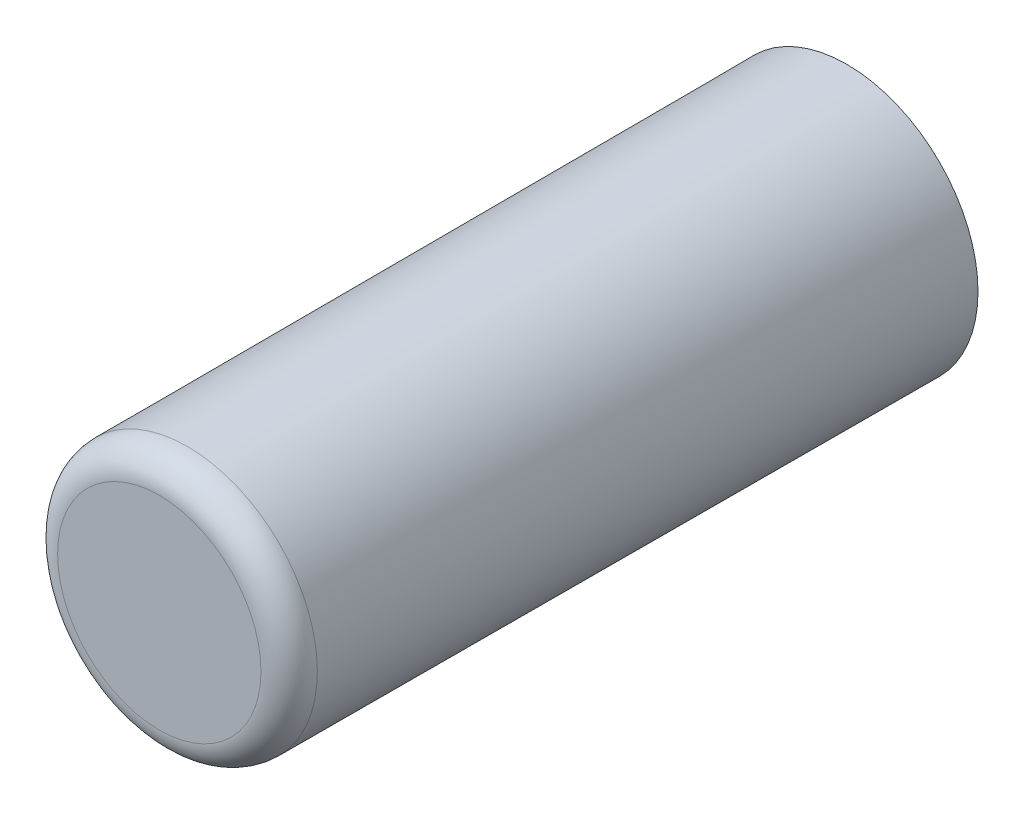
ISO-10303-21;
HEADER;
FILE_DESCRIPTION(('STEP AP214'),'2;1');
FILE_NAME('part.step','',(''),(''),'','','');
FILE_SCHEMA(('AUTOMOTIVE_DESIGN { 1 0 10303 214 1 1 1 1 }'));
ENDSEC;
DATA;
#1=APPLICATION_CONTEXT('core data for automotive mechanical design processes');
#2=APPLICATION_PROTOCOL_DEFINITION('international standard','automotive_design',2000,#1);
#3=PRODUCT_CONTEXT('',#1,'mechanical');
#4=PRODUCT('Part','Part','',(#3));
#5=PRODUCT_RELATED_PRODUCT_CATEGORY('part','',(#4));
#6=PRODUCT_DEFINITION_FORMATION('','',#4);
#7=PRODUCT_DEFINITION_CONTEXT('part definition',#1,'design');
#8=PRODUCT_DEFINITION('design','',#6,#7);
#9=PRODUCT_DEFINITION_SHAPE('','',#8);
#10=(LENGTH_UNIT() NAMED_UNIT(*) SI_UNIT(.MILLI.,.METRE.));
#11=(NAMED_UNIT(*) PLANE_ANGLE_UNIT() SI_UNIT($,.RADIAN.));
#12=(NAMED_UNIT(*) SI_UNIT($,.STERADIAN.) SOLID_ANGLE_UNIT());
#13=UNCERTAINTY_MEASURE_WITH_UNIT(LENGTH_MEASURE(1.E-05),#10,'distance_accuracy_value','');
#14=(GEOMETRIC_REPRESENTATION_CONTEXT(3) GLOBAL_UNCERTAINTY_ASSIGNED_CONTEXT((#13)) GLOBAL_UNIT_ASSIGNED_CONTEXT((#10,
#11,#12)) REPRESENTATION_CONTEXT('',''));
#15=CARTESIAN_POINT('',(0.,0.,0.));
#16=DIRECTION('',(0.,0.,1.));
#17=DIRECTION('',(1.,0.,0.));
#18=AXIS2_PLACEMENT_3D('',#15,#16,#17);
#19=CARTESIAN_POINT('',(0.,0.,0.380999999999993));
#20=DIRECTION('',(0.,0.,-1.));
#21=DIRECTION('',(-1.,0.,0.));
#22=AXIS2_PLACEMENT_3D('',#19,#20,#21);
#23=TOROIDAL_SURFACE('',#22,7.493,0.889);
#24=CARTESIAN_POINT('',(-8.382,0.,0.380999999999993));
#25=VERTEX_POINT('',#24);
#26=VERTEX_LOOP('',#25);
#27=FACE_BOUND('',#26,.T.);
#28=ADVANCED_FACE('F40',(#27),#23,.T.);
#29=CLOSED_SHELL('',(#28));
#30=MANIFOLD_SOLID_BREP('B2',#29);
#31=CARTESIAN_POINT('',(0.,0.,48.768));
#32=DIRECTION('',(0.,0.,-1.));
#33=DIRECTION('',(-1.,0.,0.));
#34=AXIS2_PLACEMENT_3D('',#31,#32,#33);
#35=PLANE('',#34);
#36=CARTESIAN_POINT('',(0.,0.,48.768));
#37=DIRECTION('',(0.,0.,-1.));
#38=DIRECTION('',(-1.,0.,0.));
#39=AXIS2_PLACEMENT_3D('',#36,#37,#38);
#40=CIRCLE('',#39,7.21140243530637);
#41=CARTESIAN_POINT('',(-7.21140243530636,0.,48.768));
#42=VERTEX_POINT('',#41);
#43=EDGE_CURVE('E39',#42,#42,#40,.F.);
#44=ORIENTED_EDGE('',*,*,#43,.T.);
#45=EDGE_LOOP('',(#44));
#46=FACE_BOUND('',#45,.T.);
#47=ADVANCED_FACE('F52',(#46),#35,.F.);
#48=CARTESIAN_POINT('',(0.,0.,48.768));
#49=DIRECTION('',(0.,0.,-1.));
#50=DIRECTION('',(-1.,0.,0.));
#51=AXIS2_PLACEMENT_3D('',#48,#49,#50);
#52=CONICAL_SURFACE('',#51,9.2075,0.00195312251647885);
#53=CARTESIAN_POINT('',(0.,0.,46.7719062425491));
#54=DIRECTION('',(0.,0.,1.));
#55=DIRECTION('',(1.,0.,0.));
#56=AXIS2_PLACEMENT_3D('',#53,#54,#55);
#57=CIRCLE('',#56,9.21139862062002);
#58=CARTESIAN_POINT('',(9.21139862062003,0.,46.7719062425491));
#59=VERTEX_POINT('',#58);
#60=EDGE_CURVE('E59',#59,#59,#57,.F.);
#61=ORIENTED_EDGE('',*,*,#60,.T.);
#62=EDGE_LOOP('',(#61));
#63=FACE_BOUND('',#62,.T.);
#64=CARTESIAN_POINT('',(0.,0.,0.));
#65=DIRECTION('',(0.,0.,-1.));
#66=DIRECTION('',(-1.,0.,0.));
#67=AXIS2_PLACEMENT_3D('',#64,#65,#66);
#68=CIRCLE('',#67,9.30275);
#69=CARTESIAN_POINT('',(-9.30275,0.,0.));
#70=VERTEX_POINT('',#69);
#71=EDGE_CURVE('E63',#70,#70,#68,.T.);
#72=ORIENTED_EDGE('',*,*,#71,.F.);
#73=EDGE_LOOP('',(#72));
#74=FACE_BOUND('',#73,.T.);
#75=ADVANCED_FACE('F123',(#63,#74),#52,.T.);
#76=CARTESIAN_POINT('',(9.30275,0.,0.));
#77=DIRECTION('',(0.,0.,1.));
#78=DIRECTION('',(1.,0.,0.));
#79=AXIS2_PLACEMENT_3D('',#76,#77,#78);
#80=PLANE('',#79);
#81=CARTESIAN_POINT('',(0.,0.,0.));
#82=DIRECTION('',(0.,0.,-1.));
#83=DIRECTION('',(-1.,0.,0.));
#84=AXIS2_PLACEMENT_3D('',#81,#82,#83);
#85=CIRCLE('',#84,8.382);
#86=CARTESIAN_POINT('',(-8.382,0.,0.));
#87=VERTEX_POINT('',#86);
#88=EDGE_CURVE('E67',#87,#87,#85,.T.);
#89=ORIENTED_EDGE('',*,*,#88,.F.);
#90=EDGE_LOOP('',(#89));
#91=FACE_BOUND('',#90,.T.);
#92=ORIENTED_EDGE('',*,*,#71,.T.);
#93=EDGE_LOOP('',(#92));
#94=FACE_BOUND('',#93,.T.);
#95=ADVANCED_FACE('F117',(#91,#94),#80,.F.);
#96=CARTESIAN_POINT('',(0.,0.,0.));
#97=DIRECTION('',(0.,0.,-1.));
#98=DIRECTION('',(-1.,0.,0.));
#99=AXIS2_PLACEMENT_3D('',#96,#97,#98);
#100=CYLINDRICAL_SURFACE('',#99,8.382);
#101=CARTESIAN_POINT('',(0.,0.,1.26999999999999));
#102=DIRECTION('',(0.,0.,-1.));
#103=DIRECTION('',(-1.,0.,0.));
#104=AXIS2_PLACEMENT_3D('',#101,#102,#103);
#105=CIRCLE('',#104,8.382);
#106=CARTESIAN_POINT('',(-8.382,0.,1.26999999999999));
#107=VERTEX_POINT('',#106);
#108=EDGE_CURVE('E72',#107,#107,#105,.T.);
#109=ORIENTED_EDGE('',*,*,#108,.F.);
#110=EDGE_LOOP('',(#109));
#111=FACE_BOUND('',#110,.T.);
#112=ORIENTED_EDGE('',*,*,#88,.T.);
#113=EDGE_LOOP('',(#112));
#114=FACE_BOUND('',#113,.T.);
#115=ADVANCED_FACE('F111',(#111,#114),#100,.F.);
#116=CARTESIAN_POINT('',(8.382,0.,1.26999999999999));
#117=DIRECTION('',(0.,0.,1.));
#118=DIRECTION('',(1.,0.,0.));
#119=AXIS2_PLACEMENT_3D('',#116,#117,#118);
#120=PLANE('',#119);
#121=CARTESIAN_POINT('',(0.,0.,1.26999999999999));
#122=DIRECTION('',(0.,0.,-1.));
#123=DIRECTION('',(-1.,0.,0.));
#124=AXIS2_PLACEMENT_3D('',#121,#122,#123);
#125=CIRCLE('',#124,6.604);
#126=CARTESIAN_POINT('',(-6.604,0.,1.26999999999999));
#127=VERTEX_POINT('',#126);
#128=EDGE_CURVE('E75',#127,#127,#125,.T.);
#129=ORIENTED_EDGE('',*,*,#128,.F.);
#130=EDGE_LOOP('',(#129));
#131=FACE_BOUND('',#130,.T.);
#132=ORIENTED_EDGE('',*,*,#108,.T.);
#133=EDGE_LOOP('',(#132));
#134=FACE_BOUND('',#133,.T.);
#135=ADVANCED_FACE('F105',(#131,#134),#120,.F.);
#136=CARTESIAN_POINT('',(0.,0.,0.));
#137=DIRECTION('',(0.,0.,-1.));
#138=DIRECTION('',(-1.,0.,0.));
#139=AXIS2_PLACEMENT_3D('',#136,#137,#138);
#140=CYLINDRICAL_SURFACE('',#139,6.604);
#141=CARTESIAN_POINT('',(0.,0.,0.));
#142=DIRECTION('',(0.,0.,-1.));
#143=DIRECTION('',(-1.,0.,0.));
#144=AXIS2_PLACEMENT_3D('',#141,#142,#143);
#145=CIRCLE('',#144,6.604);
#146=CARTESIAN_POINT('',(-6.604,0.,0.));
#147=VERTEX_POINT('',#146);
#148=EDGE_CURVE('E78',#147,#147,#145,.T.);
#149=ORIENTED_EDGE('',*,*,#148,.F.);
#150=EDGE_LOOP('',(#149));
#151=FACE_BOUND('',#150,.T.);
#152=ORIENTED_EDGE('',*,*,#128,.T.);
#153=EDGE_LOOP('',(#152));
#154=FACE_BOUND('',#153,.T.);
#155=ADVANCED_FACE('F99',(#151,#154),#140,.T.);
#156=CARTESIAN_POINT('',(6.604,0.,0.));
#157=DIRECTION('',(0.,0.,1.));
#158=DIRECTION('',(1.,0.,0.));
#159=AXIS2_PLACEMENT_3D('',#156,#157,#158);
#160=PLANE('',#159);
#161=CARTESIAN_POINT('',(0.,0.,0.));
#162=DIRECTION('',(0.,0.,-1.));
#163=DIRECTION('',(-1.,0.,0.));
#164=AXIS2_PLACEMENT_3D('',#161,#162,#163);
#165=CIRCLE('',#164,2.8067);
#166=CARTESIAN_POINT('',(-2.8067,0.,0.));
#167=VERTEX_POINT('',#166);
#168=EDGE_CURVE('E81',#167,#167,#165,.T.);
#169=ORIENTED_EDGE('',*,*,#168,.F.);
#170=EDGE_LOOP('',(#169));
#171=FACE_BOUND('',#170,.T.);
#172=ORIENTED_EDGE('',*,*,#148,.T.);
#173=EDGE_LOOP('',(#172));
#174=FACE_BOUND('',#173,.T.);
#175=ADVANCED_FACE('F93',(#171,#174),#160,.F.);
#176=CARTESIAN_POINT('',(0.,0.,0.));
#177=DIRECTION('',(0.,0.,-1.));
#178=DIRECTION('',(-1.,0.,0.));
#179=AXIS2_PLACEMENT_3D('',#176,#177,#178);
#180=CYLINDRICAL_SURFACE('',#179,2.8067);
#181=CARTESIAN_POINT('',(0.,0.,4.572));
#182=DIRECTION('',(0.,0.,-1.));
#183=DIRECTION('',(-1.,0.,0.));
#184=AXIS2_PLACEMENT_3D('',#181,#182,#183);
#185=CIRCLE('',#184,2.8067);
#186=CARTESIAN_POINT('',(-2.8067,0.,4.572));
#187=VERTEX_POINT('',#186);
#188=EDGE_CURVE('E84',#187,#187,#185,.T.);
#189=ORIENTED_EDGE('',*,*,#188,.F.);
#190=EDGE_LOOP('',(#189));
#191=FACE_BOUND('',#190,.T.);
#192=ORIENTED_EDGE('',*,*,#168,.T.);
#193=EDGE_LOOP('',(#192));
#194=FACE_BOUND('',#193,.T.);
#195=ADVANCED_FACE('F90',(#191,#194),#180,.F.);
#196=CARTESIAN_POINT('',(2.8067,0.,4.572));
#197=DIRECTION('',(0.,0.,1.));
#198=DIRECTION('',(1.,0.,0.));
#199=AXIS2_PLACEMENT_3D('',#196,#197,#198);
#200=PLANE('',#199);
#201=ORIENTED_EDGE('',*,*,#188,.T.);
#202=EDGE_LOOP('',(#201));
#203=FACE_BOUND('',#202,.T.);
#204=ADVANCED_FACE('F88',(#203),#200,.F.);
#205=CARTESIAN_POINT('',(0.,0.,46.768));
#206=DIRECTION('',(0.,0.,-1.));
#207=DIRECTION('',(-1.,0.,0.));
#208=AXIS2_PLACEMENT_3D('',#205,#206,#207);
#209=TOROIDAL_SURFACE('',#208,7.21140243530637,2.);
#210=ORIENTED_EDGE('',*,*,#43,.F.);
#211=EDGE_LOOP('',(#210));
#212=FACE_BOUND('',#211,.T.);
#213=ORIENTED_EDGE('',*,*,#60,.F.);
#214=EDGE_LOOP('',(#213));
#215=FACE_BOUND('',#214,.T.);
#216=ADVANCED_FACE('F54',(#212,#215),#209,.T.);
#217=CLOSED_SHELL('',(#47,#75,#95,#115,#135,#155,#175,#195,#204,#216));
#218=MANIFOLD_SOLID_BREP('B6',#217);
#219=ADVANCED_BREP_SHAPE_REPRESENTATION('',(#18,#30,#218),#14);
#220=SHAPE_DEFINITION_REPRESENTATION(#9,#219);
ENDSEC;
END-ISO-10303-21;
